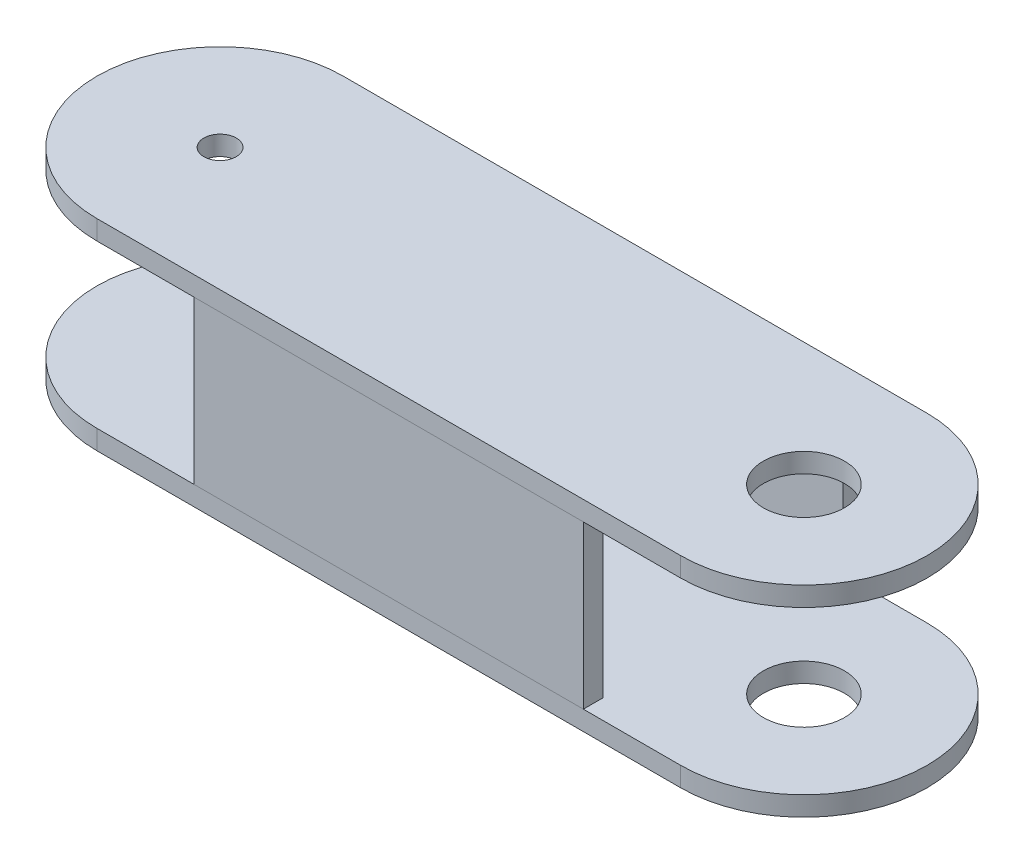
ISO-10303-21;
HEADER;
FILE_DESCRIPTION(('STEP AP214'),'2;1');
FILE_NAME('part.step','',(''),(''),'','','');
FILE_SCHEMA(('AUTOMOTIVE_DESIGN { 1 0 10303 214 1 1 1 1 }'));
ENDSEC;
DATA;
#1=APPLICATION_CONTEXT('core data for automotive mechanical design processes');
#2=APPLICATION_PROTOCOL_DEFINITION('international standard','automotive_design',2000,#1);
#3=PRODUCT_CONTEXT('',#1,'mechanical');
#4=PRODUCT('Part','Part','',(#3));
#5=PRODUCT_RELATED_PRODUCT_CATEGORY('part','',(#4));
#6=PRODUCT_DEFINITION_FORMATION('','',#4);
#7=PRODUCT_DEFINITION_CONTEXT('part definition',#1,'design');
#8=PRODUCT_DEFINITION('design','',#6,#7);
#9=PRODUCT_DEFINITION_SHAPE('','',#8);
#10=(LENGTH_UNIT() NAMED_UNIT(*) SI_UNIT(.MILLI.,.METRE.));
#11=(NAMED_UNIT(*) PLANE_ANGLE_UNIT() SI_UNIT($,.RADIAN.));
#12=(NAMED_UNIT(*) SI_UNIT($,.STERADIAN.) SOLID_ANGLE_UNIT());
#13=UNCERTAINTY_MEASURE_WITH_UNIT(LENGTH_MEASURE(1.E-05),#10,'distance_accuracy_value','');
#14=(GEOMETRIC_REPRESENTATION_CONTEXT(3) GLOBAL_UNCERTAINTY_ASSIGNED_CONTEXT((#13)) GLOBAL_UNIT_ASSIGNED_CONTEXT((#10,
#11,#12)) REPRESENTATION_CONTEXT('',''));
#15=CARTESIAN_POINT('',(0.,0.,0.));
#16=DIRECTION('',(0.,0.,1.));
#17=DIRECTION('',(1.,0.,0.));
#18=AXIS2_PLACEMENT_3D('',#15,#16,#17);
#19=CARTESIAN_POINT('',(-128.,25.,38.));
#20=DIRECTION('',(0.,1.,0.));
#21=DIRECTION('',(0.,0.,1.));
#22=AXIS2_PLACEMENT_3D('',#19,#20,#21);
#23=PLANE('',#22);
#24=DIRECTION('',(0.,0.,1.));
#25=VECTOR('',#24,1.);
#26=CARTESIAN_POINT('',(-60.,25.,38.));
#27=LINE('',#26,#25);
#28=CARTESIAN_POINT('',(-60.,25.,32.));
#29=VERTEX_POINT('',#28);
#30=CARTESIAN_POINT('',(-60.,25.,38.));
#31=VERTEX_POINT('',#30);
#32=EDGE_CURVE('E49',#29,#31,#27,.T.);
#33=ORIENTED_EDGE('',*,*,#32,.T.);
#34=DIRECTION('',(1.,0.,0.));
#35=VECTOR('',#34,1.);
#36=CARTESIAN_POINT('',(-128.,25.,38.));
#37=LINE('',#36,#35);
#38=CARTESIAN_POINT('',(60.,25.,38.));
#39=VERTEX_POINT('',#38);
#40=EDGE_CURVE('E92',#31,#39,#37,.T.);
#41=ORIENTED_EDGE('',*,*,#40,.T.);
#42=DIRECTION('',(0.,0.,-1.));
#43=VECTOR('',#42,1.);
#44=CARTESIAN_POINT('',(60.,25.,38.));
#45=LINE('',#44,#43);
#46=CARTESIAN_POINT('',(60.,25.,32.));
#47=VERTEX_POINT('',#46);
#48=EDGE_CURVE('E54',#39,#47,#45,.T.);
#49=ORIENTED_EDGE('',*,*,#48,.T.);
#50=DIRECTION('',(-1.,0.,0.));
#51=VECTOR('',#50,1.);
#52=CARTESIAN_POINT('',(-60.,25.,32.));
#53=LINE('',#52,#51);
#54=EDGE_CURVE('E12',#47,#29,#53,.T.);
#55=ORIENTED_EDGE('',*,*,#54,.T.);
#56=EDGE_LOOP('',(#33,#41,#49,#55));
#57=FACE_BOUND('',#56,.T.);
#58=ADVANCED_FACE('F46',(#57),#23,.T.);
#59=CARTESIAN_POINT('',(-60.,31.002,38.));
#60=DIRECTION('',(0.,0.,-1.));
#61=DIRECTION('',(-1.,0.,0.));
#62=AXIS2_PLACEMENT_3D('',#59,#60,#61);
#63=PLANE('',#62);
#64=ORIENTED_EDGE('',*,*,#40,.F.);
#65=DIRECTION('',(0.,-1.,0.));
#66=VECTOR('',#65,1.);
#67=CARTESIAN_POINT('',(-60.,31.002,38.));
#68=LINE('',#67,#66);
#69=CARTESIAN_POINT('',(-60.,-25.,38.));
#70=VERTEX_POINT('',#69);
#71=EDGE_CURVE('E85',#31,#70,#68,.T.);
#72=ORIENTED_EDGE('',*,*,#71,.T.);
#73=DIRECTION('',(1.,0.,0.));
#74=VECTOR('',#73,1.);
#75=CARTESIAN_POINT('',(-60.,-25.,38.));
#76=LINE('',#75,#74);
#77=CARTESIAN_POINT('',(60.,-25.,38.));
#78=VERTEX_POINT('',#77);
#79=EDGE_CURVE('E89',#70,#78,#76,.T.);
#80=ORIENTED_EDGE('',*,*,#79,.T.);
#81=DIRECTION('',(0.,-1.,0.));
#82=VECTOR('',#81,1.);
#83=CARTESIAN_POINT('',(60.,31.002,38.));
#84=LINE('',#83,#82);
#85=EDGE_CURVE('E95',#39,#78,#84,.T.);
#86=ORIENTED_EDGE('',*,*,#85,.F.);
#87=EDGE_LOOP('',(#64,#72,#80,#86));
#88=FACE_BOUND('',#87,.T.);
#89=ADVANCED_FACE('F87',(#88),#63,.F.);
#90=CARTESIAN_POINT('',(-60.,31.002,38.));
#91=DIRECTION('',(1.,0.,0.));
#92=DIRECTION('',(0.,0.,-1.));
#93=AXIS2_PLACEMENT_3D('',#90,#91,#92);
#94=PLANE('',#93);
#95=ORIENTED_EDGE('',*,*,#32,.F.);
#96=DIRECTION('',(0.,-1.,0.));
#97=VECTOR('',#96,1.);
#98=CARTESIAN_POINT('',(-60.,31.002,32.));
#99=LINE('',#98,#97);
#100=CARTESIAN_POINT('',(-60.,-25.,32.));
#101=VERTEX_POINT('',#100);
#102=EDGE_CURVE('E104',#29,#101,#99,.T.);
#103=ORIENTED_EDGE('',*,*,#102,.T.);
#104=DIRECTION('',(0.,0.,1.));
#105=VECTOR('',#104,1.);
#106=CARTESIAN_POINT('',(-60.,-25.,38.));
#107=LINE('',#106,#105);
#108=EDGE_CURVE('E101',#101,#70,#107,.T.);
#109=ORIENTED_EDGE('',*,*,#108,.T.);
#110=ORIENTED_EDGE('',*,*,#71,.F.);
#111=EDGE_LOOP('',(#95,#103,#109,#110));
#112=FACE_BOUND('',#111,.T.);
#113=ADVANCED_FACE('F106',(#112),#94,.F.);
#114=CARTESIAN_POINT('',(0.,-25.,0.));
#115=DIRECTION('',(0.,-1.,0.));
#116=DIRECTION('',(0.,0.,-1.));
#117=AXIS2_PLACEMENT_3D('',#114,#115,#116);
#118=PLANE('',#117);
#119=ORIENTED_EDGE('',*,*,#108,.F.);
#120=DIRECTION('',(-1.,0.,0.));
#121=VECTOR('',#120,1.);
#122=CARTESIAN_POINT('',(-60.,-25.,32.));
#123=LINE('',#122,#121);
#124=CARTESIAN_POINT('',(60.,-25.,32.));
#125=VERTEX_POINT('',#124);
#126=EDGE_CURVE('E108',#125,#101,#123,.T.);
#127=ORIENTED_EDGE('',*,*,#126,.F.);
#128=DIRECTION('',(0.,0.,-1.));
#129=VECTOR('',#128,1.);
#130=CARTESIAN_POINT('',(60.,-25.,38.));
#131=LINE('',#130,#129);
#132=EDGE_CURVE('E103',#78,#125,#131,.T.);
#133=ORIENTED_EDGE('',*,*,#132,.F.);
#134=ORIENTED_EDGE('',*,*,#79,.F.);
#135=EDGE_LOOP('',(#119,#127,#133,#134));
#136=FACE_BOUND('',#135,.T.);
#137=ADVANCED_FACE('F99',(#136),#118,.T.);
#138=CARTESIAN_POINT('',(60.,31.002,38.));
#139=DIRECTION('',(-1.,0.,0.));
#140=DIRECTION('',(0.,0.,1.));
#141=AXIS2_PLACEMENT_3D('',#138,#139,#140);
#142=PLANE('',#141);
#143=ORIENTED_EDGE('',*,*,#48,.F.);
#144=ORIENTED_EDGE('',*,*,#85,.T.);
#145=ORIENTED_EDGE('',*,*,#132,.T.);
#146=DIRECTION('',(0.,-1.,0.));
#147=VECTOR('',#146,1.);
#148=CARTESIAN_POINT('',(60.,31.002,32.));
#149=LINE('',#148,#147);
#150=EDGE_CURVE('E114',#47,#125,#149,.T.);
#151=ORIENTED_EDGE('',*,*,#150,.F.);
#152=EDGE_LOOP('',(#143,#144,#145,#151));
#153=FACE_BOUND('',#152,.T.);
#154=ADVANCED_FACE('F119',(#153),#142,.F.);
#155=CARTESIAN_POINT('',(-60.,31.002,32.));
#156=DIRECTION('',(0.,0.,1.));
#157=DIRECTION('',(1.,0.,0.));
#158=AXIS2_PLACEMENT_3D('',#155,#156,#157);
#159=PLANE('',#158);
#160=ORIENTED_EDGE('',*,*,#54,.F.);
#161=ORIENTED_EDGE('',*,*,#150,.T.);
#162=ORIENTED_EDGE('',*,*,#126,.T.);
#163=ORIENTED_EDGE('',*,*,#102,.F.);
#164=EDGE_LOOP('',(#160,#161,#162,#163));
#165=FACE_BOUND('',#164,.T.);
#166=ADVANCED_FACE('F120',(#165),#159,.F.);
#167=CLOSED_SHELL('',(#58,#89,#113,#137,#154,#166));
#168=MANIFOLD_SOLID_BREP('B2',#167);
#169=CARTESIAN_POINT('',(-128.,25.,38.));
#170=DIRECTION('',(0.,1.,0.));
#171=DIRECTION('',(0.,0.,1.));
#172=AXIS2_PLACEMENT_3D('',#169,#170,#171);
#173=PLANE('',#172);
#174=DIRECTION('',(0.,0.,1.));
#175=VECTOR('',#174,1.);
#176=CARTESIAN_POINT('',(-70.,25.,-38.));
#177=LINE('',#176,#175);
#178=CARTESIAN_POINT('',(-70.,25.,-38.));
#179=VERTEX_POINT('',#178);
#180=CARTESIAN_POINT('',(-70.,25.,-32.));
#181=VERTEX_POINT('',#180);
#182=EDGE_CURVE('E183',#179,#181,#177,.T.);
#183=ORIENTED_EDGE('',*,*,#182,.T.);
#184=DIRECTION('',(1.,0.,0.));
#185=VECTOR('',#184,1.);
#186=CARTESIAN_POINT('',(-70.,25.,-32.));
#187=LINE('',#186,#185);
#188=CARTESIAN_POINT('',(70.,25.,-32.));
#189=VERTEX_POINT('',#188);
#190=EDGE_CURVE('E188',#181,#189,#187,.T.);
#191=ORIENTED_EDGE('',*,*,#190,.T.);
#192=DIRECTION('',(0.,0.,-1.));
#193=VECTOR('',#192,1.);
#194=CARTESIAN_POINT('',(70.,25.,-38.));
#195=LINE('',#194,#193);
#196=CARTESIAN_POINT('',(70.,25.,-38.));
#197=VERTEX_POINT('',#196);
#198=EDGE_CURVE('E44',#189,#197,#195,.T.);
#199=ORIENTED_EDGE('',*,*,#198,.T.);
#200=DIRECTION('',(1.,0.,0.));
#201=VECTOR('',#200,1.);
#202=CARTESIAN_POINT('',(-128.,25.,-38.));
#203=LINE('',#202,#201);
#204=EDGE_CURVE('E248',#179,#197,#203,.T.);
#205=ORIENTED_EDGE('',*,*,#204,.F.);
#206=EDGE_LOOP('',(#183,#191,#199,#205));
#207=FACE_BOUND('',#206,.T.);
#208=ADVANCED_FACE('F180',(#207),#173,.T.);
#209=CARTESIAN_POINT('',(-70.,31.002,-32.));
#210=DIRECTION('',(0.,0.,-1.));
#211=DIRECTION('',(-1.,0.,0.));
#212=AXIS2_PLACEMENT_3D('',#209,#210,#211);
#213=PLANE('',#212);
#214=ORIENTED_EDGE('',*,*,#190,.F.);
#215=DIRECTION('',(0.,-1.,0.));
#216=VECTOR('',#215,1.);
#217=CARTESIAN_POINT('',(-70.,31.002,-32.));
#218=LINE('',#217,#216);
#219=CARTESIAN_POINT('',(-70.,-25.,-32.));
#220=VERTEX_POINT('',#219);
#221=EDGE_CURVE('E246',#181,#220,#218,.T.);
#222=ORIENTED_EDGE('',*,*,#221,.T.);
#223=DIRECTION('',(1.,0.,0.));
#224=VECTOR('',#223,1.);
#225=CARTESIAN_POINT('',(-70.,-25.,-32.));
#226=LINE('',#225,#224);
#227=CARTESIAN_POINT('',(70.,-25.,-32.));
#228=VERTEX_POINT('',#227);
#229=EDGE_CURVE('E241',#220,#228,#226,.T.);
#230=ORIENTED_EDGE('',*,*,#229,.T.);
#231=DIRECTION('',(0.,-1.,0.));
#232=VECTOR('',#231,1.);
#233=CARTESIAN_POINT('',(70.,31.002,-32.));
#234=LINE('',#233,#232);
#235=EDGE_CURVE('E249',#189,#228,#234,.T.);
#236=ORIENTED_EDGE('',*,*,#235,.F.);
#237=EDGE_LOOP('',(#214,#222,#230,#236));
#238=FACE_BOUND('',#237,.T.);
#239=ADVANCED_FACE('F253',(#238),#213,.F.);
#240=CARTESIAN_POINT('',(0.,-25.,0.));
#241=DIRECTION('',(0.,1.,0.));
#242=DIRECTION('',(0.,0.,1.));
#243=AXIS2_PLACEMENT_3D('',#240,#241,#242);
#244=PLANE('',#243);
#245=DIRECTION('',(0.,0.,1.));
#246=VECTOR('',#245,1.);
#247=CARTESIAN_POINT('',(-70.,-25.,-38.));
#248=LINE('',#247,#246);
#249=CARTESIAN_POINT('',(-70.,-25.,-38.));
#250=VERTEX_POINT('',#249);
#251=EDGE_CURVE('E226',#250,#220,#248,.T.);
#252=ORIENTED_EDGE('',*,*,#251,.F.);
#253=DIRECTION('',(-1.,0.,0.));
#254=VECTOR('',#253,1.);
#255=CARTESIAN_POINT('',(-70.,-25.,-38.));
#256=LINE('',#255,#254);
#257=CARTESIAN_POINT('',(70.,-25.,-38.));
#258=VERTEX_POINT('',#257);
#259=EDGE_CURVE('E229',#258,#250,#256,.T.);
#260=ORIENTED_EDGE('',*,*,#259,.F.);
#261=DIRECTION('',(0.,0.,-1.));
#262=VECTOR('',#261,1.);
#263=CARTESIAN_POINT('',(70.,-25.,-38.));
#264=LINE('',#263,#262);
#265=EDGE_CURVE('E236',#228,#258,#264,.T.);
#266=ORIENTED_EDGE('',*,*,#265,.F.);
#267=ORIENTED_EDGE('',*,*,#229,.F.);
#268=EDGE_LOOP('',(#252,#260,#266,#267));
#269=FACE_BOUND('',#268,.T.);
#270=ADVANCED_FACE('F239',(#269),#244,.F.);
#271=CARTESIAN_POINT('',(70.,31.002,-38.));
#272=DIRECTION('',(-1.,0.,0.));
#273=DIRECTION('',(0.,0.,1.));
#274=AXIS2_PLACEMENT_3D('',#271,#272,#273);
#275=PLANE('',#274);
#276=ORIENTED_EDGE('',*,*,#198,.F.);
#277=ORIENTED_EDGE('',*,*,#235,.T.);
#278=ORIENTED_EDGE('',*,*,#265,.T.);
#279=DIRECTION('',(0.,-1.,0.));
#280=VECTOR('',#279,1.);
#281=CARTESIAN_POINT('',(70.,31.002,-38.));
#282=LINE('',#281,#280);
#283=EDGE_CURVE('E228',#197,#258,#282,.T.);
#284=ORIENTED_EDGE('',*,*,#283,.F.);
#285=EDGE_LOOP('',(#276,#277,#278,#284));
#286=FACE_BOUND('',#285,.T.);
#287=ADVANCED_FACE('F254',(#286),#275,.F.);
#288=CARTESIAN_POINT('',(-70.,31.002,-38.));
#289=DIRECTION('',(1.,0.,0.));
#290=DIRECTION('',(0.,0.,-1.));
#291=AXIS2_PLACEMENT_3D('',#288,#289,#290);
#292=PLANE('',#291);
#293=ORIENTED_EDGE('',*,*,#182,.F.);
#294=DIRECTION('',(0.,-1.,0.));
#295=VECTOR('',#294,1.);
#296=CARTESIAN_POINT('',(-70.,31.002,-38.));
#297=LINE('',#296,#295);
#298=EDGE_CURVE('E221',#179,#250,#297,.T.);
#299=ORIENTED_EDGE('',*,*,#298,.T.);
#300=ORIENTED_EDGE('',*,*,#251,.T.);
#301=ORIENTED_EDGE('',*,*,#221,.F.);
#302=EDGE_LOOP('',(#293,#299,#300,#301));
#303=FACE_BOUND('',#302,.T.);
#304=ADVANCED_FACE('F223',(#303),#292,.F.);
#305=CARTESIAN_POINT('',(-70.,31.002,-38.));
#306=DIRECTION('',(0.,0.,1.));
#307=DIRECTION('',(1.,0.,0.));
#308=AXIS2_PLACEMENT_3D('',#305,#306,#307);
#309=PLANE('',#308);
#310=ORIENTED_EDGE('',*,*,#298,.F.);
#311=ORIENTED_EDGE('',*,*,#204,.T.);
#312=ORIENTED_EDGE('',*,*,#283,.T.);
#313=ORIENTED_EDGE('',*,*,#259,.T.);
#314=EDGE_LOOP('',(#310,#311,#312,#313));
#315=FACE_BOUND('',#314,.T.);
#316=ADVANCED_FACE('F232',(#315),#309,.F.);
#317=CLOSED_SHELL('',(#208,#239,#270,#287,#304,#316));
#318=MANIFOLD_SOLID_BREP('B6',#317);
#319=CARTESIAN_POINT('',(-90.,31.,38.));
#320=DIRECTION('',(0.,0.,-1.));
#321=DIRECTION('',(-1.,0.,0.));
#322=AXIS2_PLACEMENT_3D('',#319,#320,#321);
#323=PLANE('',#322);
#324=DIRECTION('',(0.,-1.,0.));
#325=VECTOR('',#324,1.);
#326=CARTESIAN_POINT('',(90.,31.,38.));
#327=LINE('',#326,#325);
#328=CARTESIAN_POINT('',(90.,-25.,38.));
#329=VERTEX_POINT('',#328);
#330=CARTESIAN_POINT('',(90.,-31.,38.));
#331=VERTEX_POINT('',#330);
#332=EDGE_CURVE('E357',#329,#331,#327,.T.);
#333=ORIENTED_EDGE('',*,*,#332,.F.);
#334=DIRECTION('',(1.,0.,0.));
#335=VECTOR('',#334,1.);
#336=CARTESIAN_POINT('',(-128.,-25.,38.));
#337=LINE('',#336,#335);
#338=CARTESIAN_POINT('',(-90.,-25.,38.));
#339=VERTEX_POINT('',#338);
#340=EDGE_CURVE('E178',#339,#329,#337,.T.);
#341=ORIENTED_EDGE('',*,*,#340,.F.);
#342=DIRECTION('',(0.,-1.,0.));
#343=VECTOR('',#342,1.);
#344=CARTESIAN_POINT('',(-90.,31.,38.));
#345=LINE('',#344,#343);
#346=CARTESIAN_POINT('',(-90.,-31.,38.));
#347=VERTEX_POINT('',#346);
#348=EDGE_CURVE('E376',#339,#347,#345,.T.);
#349=ORIENTED_EDGE('',*,*,#348,.T.);
#350=DIRECTION('',(1.,0.,0.));
#351=VECTOR('',#350,1.);
#352=CARTESIAN_POINT('',(-90.,-31.,38.));
#353=LINE('',#352,#351);
#354=EDGE_CURVE('E365',#347,#331,#353,.T.);
#355=ORIENTED_EDGE('',*,*,#354,.T.);
#356=EDGE_LOOP('',(#333,#341,#349,#355));
#357=FACE_BOUND('',#356,.T.);
#358=ADVANCED_FACE('F313',(#357),#323,.F.);
#359=CARTESIAN_POINT('',(-90.,31.,-38.));
#360=DIRECTION('',(0.,0.,1.));
#361=DIRECTION('',(1.,0.,0.));
#362=AXIS2_PLACEMENT_3D('',#359,#360,#361);
#363=PLANE('',#362);
#364=DIRECTION('',(0.,-1.,0.));
#365=VECTOR('',#364,1.);
#366=CARTESIAN_POINT('',(-90.,31.,-38.));
#367=LINE('',#366,#365);
#368=CARTESIAN_POINT('',(-90.,-25.,-38.));
#369=VERTEX_POINT('',#368);
#370=CARTESIAN_POINT('',(-90.,-31.,-38.));
#371=VERTEX_POINT('',#370);
#372=EDGE_CURVE('E317',#369,#371,#367,.T.);
#373=ORIENTED_EDGE('',*,*,#372,.F.);
#374=DIRECTION('',(1.,0.,0.));
#375=VECTOR('',#374,1.);
#376=CARTESIAN_POINT('',(-128.,-25.,-38.));
#377=LINE('',#376,#375);
#378=CARTESIAN_POINT('',(90.,-25.,-38.));
#379=VERTEX_POINT('',#378);
#380=EDGE_CURVE('E352',#369,#379,#377,.T.);
#381=ORIENTED_EDGE('',*,*,#380,.T.);
#382=DIRECTION('',(0.,-1.,0.));
#383=VECTOR('',#382,1.);
#384=CARTESIAN_POINT('',(90.,31.,-38.));
#385=LINE('',#384,#383);
#386=CARTESIAN_POINT('',(90.,-31.,-38.));
#387=VERTEX_POINT('',#386);
#388=EDGE_CURVE('E363',#379,#387,#385,.T.);
#389=ORIENTED_EDGE('',*,*,#388,.T.);
#390=DIRECTION('',(-1.,0.,0.));
#391=VECTOR('',#390,1.);
#392=CARTESIAN_POINT('',(-90.,-31.,-38.));
#393=LINE('',#392,#391);
#394=EDGE_CURVE('E371',#387,#371,#393,.T.);
#395=ORIENTED_EDGE('',*,*,#394,.T.);
#396=EDGE_LOOP('',(#373,#381,#389,#395));
#397=FACE_BOUND('',#396,.T.);
#398=ADVANCED_FACE('F361',(#397),#363,.F.);
#399=CARTESIAN_POINT('',(90.,31.,0.));
#400=DIRECTION('',(0.,-1.,0.));
#401=DIRECTION('',(0.,0.,-1.));
#402=AXIS2_PLACEMENT_3D('',#399,#400,#401);
#403=CYLINDRICAL_SURFACE('',#402,12.5);
#404=CARTESIAN_POINT('',(90.,-25.,0.));
#405=DIRECTION('',(0.,-1.,0.));
#406=DIRECTION('',(0.,0.,-1.));
#407=AXIS2_PLACEMENT_3D('',#404,#405,#406);
#408=CIRCLE('',#407,12.5);
#409=CARTESIAN_POINT('',(90.,-25.,-12.5));
#410=VERTEX_POINT('',#409);
#411=EDGE_CURVE('E378',#410,#410,#408,.T.);
#412=ORIENTED_EDGE('',*,*,#411,.F.);
#413=EDGE_LOOP('',(#412));
#414=FACE_BOUND('',#413,.T.);
#415=CARTESIAN_POINT('',(90.,-31.,0.));
#416=DIRECTION('',(0.,1.,0.));
#417=DIRECTION('',(0.,0.,1.));
#418=AXIS2_PLACEMENT_3D('',#415,#416,#417);
#419=CIRCLE('',#418,12.5);
#420=CARTESIAN_POINT('',(90.,-31.,12.5));
#421=VERTEX_POINT('',#420);
#422=EDGE_CURVE('E372',#421,#421,#419,.T.);
#423=ORIENTED_EDGE('',*,*,#422,.F.);
#424=EDGE_LOOP('',(#423));
#425=FACE_BOUND('',#424,.T.);
#426=ADVANCED_FACE('F399',(#414,#425),#403,.F.);
#427=CARTESIAN_POINT('',(-90.,31.,0.));
#428=DIRECTION('',(0.,-1.,0.));
#429=DIRECTION('',(0.,0.,-1.));
#430=AXIS2_PLACEMENT_3D('',#427,#428,#429);
#431=CYLINDRICAL_SURFACE('',#430,5.);
#432=CARTESIAN_POINT('',(-90.,-25.,0.));
#433=DIRECTION('',(0.,-1.,0.));
#434=DIRECTION('',(0.,0.,-1.));
#435=AXIS2_PLACEMENT_3D('',#432,#433,#434);
#436=CIRCLE('',#435,5.);
#437=CARTESIAN_POINT('',(-90.,-25.,-5.00000000000001));
#438=VERTEX_POINT('',#437);
#439=EDGE_CURVE('E323',#438,#438,#436,.T.);
#440=ORIENTED_EDGE('',*,*,#439,.F.);
#441=EDGE_LOOP('',(#440));
#442=FACE_BOUND('',#441,.T.);
#443=CARTESIAN_POINT('',(-90.,-31.,0.));
#444=DIRECTION('',(0.,1.,0.));
#445=DIRECTION('',(0.,0.,1.));
#446=AXIS2_PLACEMENT_3D('',#443,#444,#445);
#447=CIRCLE('',#446,5.);
#448=CARTESIAN_POINT('',(-90.,-31.,5.));
#449=VERTEX_POINT('',#448);
#450=EDGE_CURVE('E382',#449,#449,#447,.T.);
#451=ORIENTED_EDGE('',*,*,#450,.F.);
#452=EDGE_LOOP('',(#451));
#453=FACE_BOUND('',#452,.T.);
#454=ADVANCED_FACE('F315',(#442,#453),#431,.F.);
#455=CARTESIAN_POINT('',(-90.,-31.,0.));
#456=DIRECTION('',(0.,1.,0.));
#457=DIRECTION('',(0.,0.,1.));
#458=AXIS2_PLACEMENT_3D('',#455,#456,#457);
#459=PLANE('',#458);
#460=CARTESIAN_POINT('',(-90.,-31.,0.));
#461=DIRECTION('',(0.,1.,0.));
#462=DIRECTION('',(0.,0.,1.));
#463=AXIS2_PLACEMENT_3D('',#460,#461,#462);
#464=CIRCLE('',#463,38.);
#465=EDGE_CURVE('E358',#371,#347,#464,.T.);
#466=ORIENTED_EDGE('',*,*,#465,.F.);
#467=ORIENTED_EDGE('',*,*,#394,.F.);
#468=CARTESIAN_POINT('',(90.,-31.,0.));
#469=DIRECTION('',(0.,1.,0.));
#470=DIRECTION('',(0.,0.,1.));
#471=AXIS2_PLACEMENT_3D('',#468,#469,#470);
#472=CIRCLE('',#471,38.);
#473=EDGE_CURVE('E369',#331,#387,#472,.T.);
#474=ORIENTED_EDGE('',*,*,#473,.F.);
#475=ORIENTED_EDGE('',*,*,#354,.F.);
#476=EDGE_LOOP('',(#466,#467,#474,#475));
#477=FACE_BOUND('',#476,.T.);
#478=ORIENTED_EDGE('',*,*,#422,.T.);
#479=EDGE_LOOP('',(#478));
#480=FACE_BOUND('',#479,.T.);
#481=ORIENTED_EDGE('',*,*,#450,.T.);
#482=EDGE_LOOP('',(#481));
#483=FACE_BOUND('',#482,.T.);
#484=ADVANCED_FACE('F398',(#477,#480,#483),#459,.F.);
#485=CARTESIAN_POINT('',(-90.,31.,0.));
#486=DIRECTION('',(0.,-1.,0.));
#487=DIRECTION('',(0.,0.,-1.));
#488=AXIS2_PLACEMENT_3D('',#485,#486,#487);
#489=CYLINDRICAL_SURFACE('',#488,38.);
#490=ORIENTED_EDGE('',*,*,#348,.F.);
#491=CARTESIAN_POINT('',(-90.,-25.,0.));
#492=DIRECTION('',(0.,-1.,0.));
#493=DIRECTION('',(0.,0.,-1.));
#494=AXIS2_PLACEMENT_3D('',#491,#492,#493);
#495=CIRCLE('',#494,38.);
#496=EDGE_CURVE('E329',#339,#369,#495,.T.);
#497=ORIENTED_EDGE('',*,*,#496,.T.);
#498=ORIENTED_EDGE('',*,*,#372,.T.);
#499=ORIENTED_EDGE('',*,*,#465,.T.);
#500=EDGE_LOOP('',(#490,#497,#498,#499));
#501=FACE_BOUND('',#500,.T.);
#502=ADVANCED_FACE('F403',(#501),#489,.T.);
#503=CARTESIAN_POINT('',(90.,31.,0.));
#504=DIRECTION('',(0.,-1.,0.));
#505=DIRECTION('',(0.,0.,-1.));
#506=AXIS2_PLACEMENT_3D('',#503,#504,#505);
#507=CYLINDRICAL_SURFACE('',#506,38.);
#508=ORIENTED_EDGE('',*,*,#388,.F.);
#509=CARTESIAN_POINT('',(90.,-25.,0.));
#510=DIRECTION('',(0.,-1.,0.));
#511=DIRECTION('',(0.,0.,-1.));
#512=AXIS2_PLACEMENT_3D('',#509,#510,#511);
#513=CIRCLE('',#512,38.);
#514=EDGE_CURVE('E349',#379,#329,#513,.T.);
#515=ORIENTED_EDGE('',*,*,#514,.T.);
#516=ORIENTED_EDGE('',*,*,#332,.T.);
#517=ORIENTED_EDGE('',*,*,#473,.T.);
#518=EDGE_LOOP('',(#508,#515,#516,#517));
#519=FACE_BOUND('',#518,.T.);
#520=ADVANCED_FACE('F367',(#519),#507,.T.);
#521=CARTESIAN_POINT('',(-128.,-25.,38.));
#522=DIRECTION('',(0.,-1.,0.));
#523=DIRECTION('',(0.,0.,-1.));
#524=AXIS2_PLACEMENT_3D('',#521,#522,#523);
#525=PLANE('',#524);
#526=ORIENTED_EDGE('',*,*,#411,.T.);
#527=EDGE_LOOP('',(#526));
#528=FACE_BOUND('',#527,.T.);
#529=ORIENTED_EDGE('',*,*,#439,.T.);
#530=EDGE_LOOP('',(#529));
#531=FACE_BOUND('',#530,.T.);
#532=ORIENTED_EDGE('',*,*,#340,.T.);
#533=ORIENTED_EDGE('',*,*,#514,.F.);
#534=ORIENTED_EDGE('',*,*,#380,.F.);
#535=ORIENTED_EDGE('',*,*,#496,.F.);
#536=EDGE_LOOP('',(#532,#533,#534,#535));
#537=FACE_BOUND('',#536,.T.);
#538=ADVANCED_FACE('F351',(#528,#531,#537),#525,.F.);
#539=CLOSED_SHELL('',(#358,#398,#426,#454,#484,#502,#520,#538));
#540=MANIFOLD_SOLID_BREP('B38',#539);
#541=CARTESIAN_POINT('',(-90.,31.,-38.));
#542=DIRECTION('',(0.,0.,1.));
#543=DIRECTION('',(1.,0.,0.));
#544=AXIS2_PLACEMENT_3D('',#541,#542,#543);
#545=PLANE('',#544);
#546=DIRECTION('',(0.,-1.,0.));
#547=VECTOR('',#546,1.);
#548=CARTESIAN_POINT('',(90.,31.,-38.));
#549=LINE('',#548,#547);
#550=CARTESIAN_POINT('',(90.,31.,-38.));
#551=VERTEX_POINT('',#550);
#552=CARTESIAN_POINT('',(90.,25.,-38.));
#553=VERTEX_POINT('',#552);
#554=EDGE_CURVE('E553',#551,#553,#549,.T.);
#555=ORIENTED_EDGE('',*,*,#554,.T.);
#556=DIRECTION('',(1.,0.,0.));
#557=VECTOR('',#556,1.);
#558=CARTESIAN_POINT('',(-128.,25.,-38.));
#559=LINE('',#558,#557);
#560=CARTESIAN_POINT('',(-90.,25.,-38.));
#561=VERTEX_POINT('',#560);
#562=EDGE_CURVE('E534',#561,#553,#559,.T.);
#563=ORIENTED_EDGE('',*,*,#562,.F.);
#564=DIRECTION('',(0.,-1.,0.));
#565=VECTOR('',#564,1.);
#566=CARTESIAN_POINT('',(-90.,31.,-38.));
#567=LINE('',#566,#565);
#568=CARTESIAN_POINT('',(-90.,31.,-38.));
#569=VERTEX_POINT('',#568);
#570=EDGE_CURVE('E524',#569,#561,#567,.T.);
#571=ORIENTED_EDGE('',*,*,#570,.F.);
#572=DIRECTION('',(-1.,0.,0.));
#573=VECTOR('',#572,1.);
#574=CARTESIAN_POINT('',(-90.,31.,-38.));
#575=LINE('',#574,#573);
#576=EDGE_CURVE('E503',#551,#569,#575,.T.);
#577=ORIENTED_EDGE('',*,*,#576,.F.);
#578=EDGE_LOOP('',(#555,#563,#571,#577));
#579=FACE_BOUND('',#578,.T.);
#580=ADVANCED_FACE('F479',(#579),#545,.F.);
#581=CARTESIAN_POINT('',(90.,31.,0.));
#582=DIRECTION('',(0.,-1.,0.));
#583=DIRECTION('',(0.,0.,-1.));
#584=AXIS2_PLACEMENT_3D('',#581,#582,#583);
#585=CYLINDRICAL_SURFACE('',#584,38.);
#586=DIRECTION('',(0.,-1.,0.));
#587=VECTOR('',#586,1.);
#588=CARTESIAN_POINT('',(90.,31.,38.));
#589=LINE('',#588,#587);
#590=CARTESIAN_POINT('',(90.,31.,38.));
#591=VERTEX_POINT('',#590);
#592=CARTESIAN_POINT('',(90.,25.,38.));
#593=VERTEX_POINT('',#592);
#594=EDGE_CURVE('E488',#591,#593,#589,.T.);
#595=ORIENTED_EDGE('',*,*,#594,.T.);
#596=CARTESIAN_POINT('',(90.,25.,0.));
#597=DIRECTION('',(0.,1.,0.));
#598=DIRECTION('',(0.,0.,1.));
#599=AXIS2_PLACEMENT_3D('',#596,#597,#598);
#600=CIRCLE('',#599,38.);
#601=EDGE_CURVE('E526',#593,#553,#600,.T.);
#602=ORIENTED_EDGE('',*,*,#601,.T.);
#603=ORIENTED_EDGE('',*,*,#554,.F.);
#604=CARTESIAN_POINT('',(90.,31.,0.));
#605=DIRECTION('',(0.,1.,0.));
#606=DIRECTION('',(0.,0.,1.));
#607=AXIS2_PLACEMENT_3D('',#604,#605,#606);
#608=CIRCLE('',#607,38.);
#609=EDGE_CURVE('E539',#591,#551,#608,.T.);
#610=ORIENTED_EDGE('',*,*,#609,.F.);
#611=EDGE_LOOP('',(#595,#602,#603,#610));
#612=FACE_BOUND('',#611,.T.);
#613=ADVANCED_FACE('F557',(#612),#585,.T.);
#614=CARTESIAN_POINT('',(-90.,31.,38.));
#615=DIRECTION('',(0.,0.,-1.));
#616=DIRECTION('',(-1.,0.,0.));
#617=AXIS2_PLACEMENT_3D('',#614,#615,#616);
#618=PLANE('',#617);
#619=DIRECTION('',(0.,-1.,0.));
#620=VECTOR('',#619,1.);
#621=CARTESIAN_POINT('',(-90.,31.,38.));
#622=LINE('',#621,#620);
#623=CARTESIAN_POINT('',(-90.,31.,38.));
#624=VERTEX_POINT('',#623);
#625=CARTESIAN_POINT('',(-90.,25.,38.));
#626=VERTEX_POINT('',#625);
#627=EDGE_CURVE('E311',#624,#626,#622,.T.);
#628=ORIENTED_EDGE('',*,*,#627,.T.);
#629=DIRECTION('',(1.,0.,0.));
#630=VECTOR('',#629,1.);
#631=CARTESIAN_POINT('',(-128.,25.,38.));
#632=LINE('',#631,#630);
#633=EDGE_CURVE('E529',#626,#593,#632,.T.);
#634=ORIENTED_EDGE('',*,*,#633,.T.);
#635=ORIENTED_EDGE('',*,*,#594,.F.);
#636=DIRECTION('',(1.,0.,0.));
#637=VECTOR('',#636,1.);
#638=CARTESIAN_POINT('',(-90.,31.,38.));
#639=LINE('',#638,#637);
#640=EDGE_CURVE('E537',#624,#591,#639,.T.);
#641=ORIENTED_EDGE('',*,*,#640,.F.);
#642=EDGE_LOOP('',(#628,#634,#635,#641));
#643=FACE_BOUND('',#642,.T.);
#644=ADVANCED_FACE('F536',(#643),#618,.F.);
#645=CARTESIAN_POINT('',(-90.,31.,0.));
#646=DIRECTION('',(0.,-1.,0.));
#647=DIRECTION('',(0.,0.,-1.));
#648=AXIS2_PLACEMENT_3D('',#645,#646,#647);
#649=CYLINDRICAL_SURFACE('',#648,38.);
#650=ORIENTED_EDGE('',*,*,#570,.T.);
#651=CARTESIAN_POINT('',(-90.,25.,0.));
#652=DIRECTION('',(0.,1.,0.));
#653=DIRECTION('',(0.,0.,1.));
#654=AXIS2_PLACEMENT_3D('',#651,#652,#653);
#655=CIRCLE('',#654,38.);
#656=EDGE_CURVE('E495',#561,#626,#655,.T.);
#657=ORIENTED_EDGE('',*,*,#656,.T.);
#658=ORIENTED_EDGE('',*,*,#627,.F.);
#659=CARTESIAN_POINT('',(-90.,31.,0.));
#660=DIRECTION('',(0.,1.,0.));
#661=DIRECTION('',(0.,0.,1.));
#662=AXIS2_PLACEMENT_3D('',#659,#660,#661);
#663=CIRCLE('',#662,38.);
#664=EDGE_CURVE('E540',#569,#624,#663,.T.);
#665=ORIENTED_EDGE('',*,*,#664,.F.);
#666=EDGE_LOOP('',(#650,#657,#658,#665));
#667=FACE_BOUND('',#666,.T.);
#668=ADVANCED_FACE('F481',(#667),#649,.T.);
#669=CARTESIAN_POINT('',(90.,31.,0.));
#670=DIRECTION('',(0.,-1.,0.));
#671=DIRECTION('',(0.,0.,-1.));
#672=AXIS2_PLACEMENT_3D('',#669,#670,#671);
#673=CYLINDRICAL_SURFACE('',#672,12.5);
#674=CARTESIAN_POINT('',(90.,25.,0.));
#675=DIRECTION('',(0.,1.,0.));
#676=DIRECTION('',(0.,0.,1.));
#677=AXIS2_PLACEMENT_3D('',#674,#675,#676);
#678=CIRCLE('',#677,12.5);
#679=CARTESIAN_POINT('',(90.,25.,12.5));
#680=VERTEX_POINT('',#679);
#681=EDGE_CURVE('E562',#680,#680,#678,.T.);
#682=ORIENTED_EDGE('',*,*,#681,.F.);
#683=EDGE_LOOP('',(#682));
#684=FACE_BOUND('',#683,.T.);
#685=CARTESIAN_POINT('',(90.,31.,0.));
#686=DIRECTION('',(0.,1.,0.));
#687=DIRECTION('',(0.,0.,1.));
#688=AXIS2_PLACEMENT_3D('',#685,#686,#687);
#689=CIRCLE('',#688,12.5);
#690=CARTESIAN_POINT('',(90.,31.,12.5));
#691=VERTEX_POINT('',#690);
#692=EDGE_CURVE('E544',#691,#691,#689,.T.);
#693=ORIENTED_EDGE('',*,*,#692,.T.);
#694=EDGE_LOOP('',(#693));
#695=FACE_BOUND('',#694,.T.);
#696=ADVANCED_FACE('F570',(#684,#695),#673,.F.);
#697=CARTESIAN_POINT('',(-90.,31.,0.));
#698=DIRECTION('',(0.,1.,0.));
#699=DIRECTION('',(0.,0.,1.));
#700=AXIS2_PLACEMENT_3D('',#697,#698,#699);
#701=PLANE('',#700);
#702=ORIENTED_EDGE('',*,*,#692,.F.);
#703=EDGE_LOOP('',(#702));
#704=FACE_BOUND('',#703,.T.);
#705=ORIENTED_EDGE('',*,*,#664,.T.);
#706=ORIENTED_EDGE('',*,*,#640,.T.);
#707=ORIENTED_EDGE('',*,*,#609,.T.);
#708=ORIENTED_EDGE('',*,*,#576,.T.);
#709=EDGE_LOOP('',(#705,#706,#707,#708));
#710=FACE_BOUND('',#709,.T.);
#711=CARTESIAN_POINT('',(-90.,31.,0.));
#712=DIRECTION('',(0.,1.,0.));
#713=DIRECTION('',(0.,0.,1.));
#714=AXIS2_PLACEMENT_3D('',#711,#712,#713);
#715=CIRCLE('',#714,5.);
#716=CARTESIAN_POINT('',(-90.,31.,5.));
#717=VERTEX_POINT('',#716);
#718=EDGE_CURVE('E525',#717,#717,#715,.T.);
#719=ORIENTED_EDGE('',*,*,#718,.F.);
#720=EDGE_LOOP('',(#719));
#721=FACE_BOUND('',#720,.T.);
#722=ADVANCED_FACE('F542',(#704,#710,#721),#701,.T.);
#723=CARTESIAN_POINT('',(-90.,31.,0.));
#724=DIRECTION('',(0.,-1.,0.));
#725=DIRECTION('',(0.,0.,-1.));
#726=AXIS2_PLACEMENT_3D('',#723,#724,#725);
#727=CYLINDRICAL_SURFACE('',#726,5.);
#728=CARTESIAN_POINT('',(-90.,25.,0.));
#729=DIRECTION('',(0.,1.,0.));
#730=DIRECTION('',(0.,0.,1.));
#731=AXIS2_PLACEMENT_3D('',#728,#729,#730);
#732=CIRCLE('',#731,5.);
#733=CARTESIAN_POINT('',(-90.,25.,5.));
#734=VERTEX_POINT('',#733);
#735=EDGE_CURVE('E483',#734,#734,#732,.T.);
#736=ORIENTED_EDGE('',*,*,#735,.F.);
#737=EDGE_LOOP('',(#736));
#738=FACE_BOUND('',#737,.T.);
#739=ORIENTED_EDGE('',*,*,#718,.T.);
#740=EDGE_LOOP('',(#739));
#741=FACE_BOUND('',#740,.T.);
#742=ADVANCED_FACE('F568',(#738,#741),#727,.F.);
#743=CARTESIAN_POINT('',(-128.,25.,38.));
#744=DIRECTION('',(0.,1.,0.));
#745=DIRECTION('',(0.,0.,1.));
#746=AXIS2_PLACEMENT_3D('',#743,#744,#745);
#747=PLANE('',#746);
#748=ORIENTED_EDGE('',*,*,#681,.T.);
#749=EDGE_LOOP('',(#748));
#750=FACE_BOUND('',#749,.T.);
#751=ORIENTED_EDGE('',*,*,#735,.T.);
#752=EDGE_LOOP('',(#751));
#753=FACE_BOUND('',#752,.T.);
#754=ORIENTED_EDGE('',*,*,#562,.T.);
#755=ORIENTED_EDGE('',*,*,#601,.F.);
#756=ORIENTED_EDGE('',*,*,#633,.F.);
#757=ORIENTED_EDGE('',*,*,#656,.F.);
#758=EDGE_LOOP('',(#754,#755,#756,#757));
#759=FACE_BOUND('',#758,.T.);
#760=ADVANCED_FACE('F530',(#750,#753,#759),#747,.F.);
#761=CLOSED_SHELL('',(#580,#613,#644,#668,#696,#722,#742,#760));
#762=MANIFOLD_SOLID_BREP('B172',#761);
#763=ADVANCED_BREP_SHAPE_REPRESENTATION('',(#18,#168,#318,#540,#762),#14);
#764=SHAPE_DEFINITION_REPRESENTATION(#9,#763);
ENDSEC;
END-ISO-10303-21;
